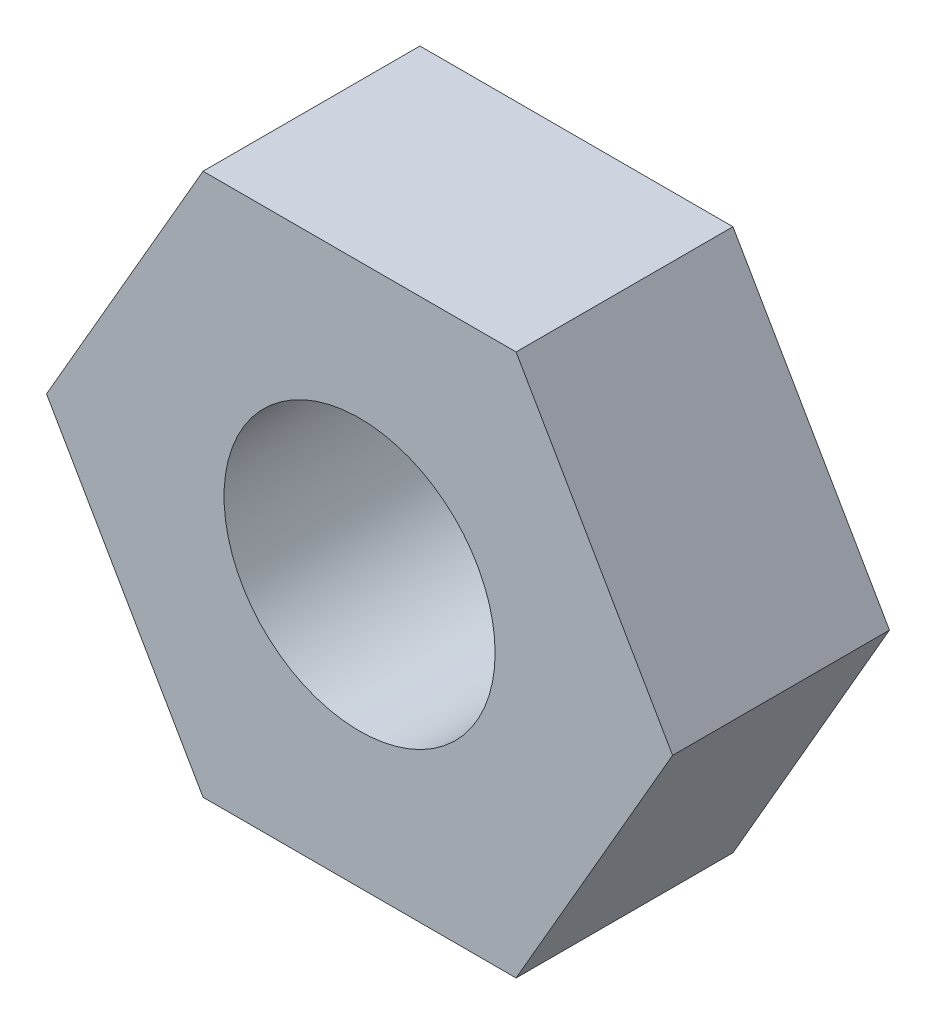
ISO-10303-21;
HEADER;
FILE_DESCRIPTION(('STEP AP214'),'2;1');
FILE_NAME('part.step','',(''),(''),'','','');
FILE_SCHEMA(('AUTOMOTIVE_DESIGN { 1 0 10303 214 1 1 1 1 }'));
ENDSEC;
DATA;
#1=APPLICATION_CONTEXT('core data for automotive mechanical design processes');
#2=APPLICATION_PROTOCOL_DEFINITION('international standard','automotive_design',2000,#1);
#3=PRODUCT_CONTEXT('',#1,'mechanical');
#4=PRODUCT('Part','Part','',(#3));
#5=PRODUCT_RELATED_PRODUCT_CATEGORY('part','',(#4));
#6=PRODUCT_DEFINITION_FORMATION('','',#4);
#7=PRODUCT_DEFINITION_CONTEXT('part definition',#1,'design');
#8=PRODUCT_DEFINITION('design','',#6,#7);
#9=PRODUCT_DEFINITION_SHAPE('','',#8);
#10=(LENGTH_UNIT() NAMED_UNIT(*) SI_UNIT(.MILLI.,.METRE.));
#11=(NAMED_UNIT(*) PLANE_ANGLE_UNIT() SI_UNIT($,.RADIAN.));
#12=(NAMED_UNIT(*) SI_UNIT($,.STERADIAN.) SOLID_ANGLE_UNIT());
#13=UNCERTAINTY_MEASURE_WITH_UNIT(LENGTH_MEASURE(1.E-05),#10,'distance_accuracy_value','');
#14=(GEOMETRIC_REPRESENTATION_CONTEXT(3) GLOBAL_UNCERTAINTY_ASSIGNED_CONTEXT((#13)) GLOBAL_UNIT_ASSIGNED_CONTEXT((#10,
#11,#12)) REPRESENTATION_CONTEXT('',''));
#15=CARTESIAN_POINT('',(0.,0.,0.));
#16=DIRECTION('',(0.,0.,1.));
#17=DIRECTION('',(1.,0.,0.));
#18=AXIS2_PLACEMENT_3D('',#15,#16,#17);
#19=CARTESIAN_POINT('',(0.,0.,1.6));
#20=DIRECTION('',(0.,0.,1.));
#21=DIRECTION('',(1.,0.,0.));
#22=AXIS2_PLACEMENT_3D('',#19,#20,#21);
#23=PLANE('',#22);
#24=DIRECTION('',(0.5,0.866025403784439,0.));
#25=VECTOR('',#24,1.);
#26=CARTESIAN_POINT('',(1.15470053837925,-2.,1.6));
#27=LINE('',#26,#25);
#28=CARTESIAN_POINT('',(1.15470053837925,-2.,1.6));
#29=VERTEX_POINT('',#28);
#30=CARTESIAN_POINT('',(2.3094010767585,0.,1.6));
#31=VERTEX_POINT('',#30);
#32=EDGE_CURVE('E130',#29,#31,#27,.T.);
#33=ORIENTED_EDGE('',*,*,#32,.T.);
#34=DIRECTION('',(-0.5,0.866025403784439,0.));
#35=VECTOR('',#34,1.);
#36=CARTESIAN_POINT('',(2.3094010767585,0.,1.6));
#37=LINE('',#36,#35);
#38=CARTESIAN_POINT('',(1.15470053837925,2.,1.6));
#39=VERTEX_POINT('',#38);
#40=EDGE_CURVE('E88',#31,#39,#37,.T.);
#41=ORIENTED_EDGE('',*,*,#40,.T.);
#42=DIRECTION('',(-1.,0.,0.));
#43=VECTOR('',#42,1.);
#44=CARTESIAN_POINT('',(1.15470053837925,2.,1.6));
#45=LINE('',#44,#43);
#46=CARTESIAN_POINT('',(-1.15470053837925,2.,1.6));
#47=VERTEX_POINT('',#46);
#48=EDGE_CURVE('E101',#39,#47,#45,.T.);
#49=ORIENTED_EDGE('',*,*,#48,.T.);
#50=DIRECTION('',(-0.5,-0.866025403784438,0.));
#51=VECTOR('',#50,1.);
#52=CARTESIAN_POINT('',(-1.15470053837925,2.,1.6));
#53=LINE('',#52,#51);
#54=CARTESIAN_POINT('',(-2.3094010767585,0.,1.6));
#55=VERTEX_POINT('',#54);
#56=EDGE_CURVE('E95',#47,#55,#53,.T.);
#57=ORIENTED_EDGE('',*,*,#56,.T.);
#58=DIRECTION('',(0.5,-0.866025403784439,0.));
#59=VECTOR('',#58,1.);
#60=CARTESIAN_POINT('',(-2.3094010767585,0.,1.6));
#61=LINE('',#60,#59);
#62=CARTESIAN_POINT('',(-1.15470053837925,-2.,1.6));
#63=VERTEX_POINT('',#62);
#64=EDGE_CURVE('E99',#55,#63,#61,.T.);
#65=ORIENTED_EDGE('',*,*,#64,.T.);
#66=DIRECTION('',(1.,0.,0.));
#67=VECTOR('',#66,1.);
#68=CARTESIAN_POINT('',(-1.15470053837925,-2.,1.6));
#69=LINE('',#68,#67);
#70=EDGE_CURVE('E51',#63,#29,#69,.T.);
#71=ORIENTED_EDGE('',*,*,#70,.T.);
#72=EDGE_LOOP('',(#33,#41,#49,#57,#65,#71));
#73=FACE_BOUND('',#72,.T.);
#74=CARTESIAN_POINT('',(0.,0.,1.6));
#75=DIRECTION('',(0.,0.,1.));
#76=DIRECTION('',(1.,0.,0.));
#77=AXIS2_PLACEMENT_3D('',#74,#75,#76);
#78=CIRCLE('',#77,1.);
#79=CARTESIAN_POINT('',(1.,0.,1.6));
#80=VERTEX_POINT('',#79);
#81=EDGE_CURVE('E123',#80,#80,#78,.T.);
#82=ORIENTED_EDGE('',*,*,#81,.F.);
#83=EDGE_LOOP('',(#82));
#84=FACE_BOUND('',#83,.T.);
#85=ADVANCED_FACE('F34',(#73,#84),#23,.T.);
#86=CARTESIAN_POINT('',(0.,0.,0.));
#87=DIRECTION('',(0.,0.,1.));
#88=DIRECTION('',(1.,0.,0.));
#89=AXIS2_PLACEMENT_3D('',#86,#87,#88);
#90=PLANE('',#89);
#91=DIRECTION('',(0.5,0.866025403784439,0.));
#92=VECTOR('',#91,1.);
#93=CARTESIAN_POINT('',(1.15470053837925,-2.,0.));
#94=LINE('',#93,#92);
#95=CARTESIAN_POINT('',(1.15470053837925,-2.,0.));
#96=VERTEX_POINT('',#95);
#97=CARTESIAN_POINT('',(2.3094010767585,0.,0.));
#98=VERTEX_POINT('',#97);
#99=EDGE_CURVE('E119',#96,#98,#94,.T.);
#100=ORIENTED_EDGE('',*,*,#99,.F.);
#101=DIRECTION('',(1.,0.,0.));
#102=VECTOR('',#101,1.);
#103=CARTESIAN_POINT('',(-1.15470053837925,-2.,0.));
#104=LINE('',#103,#102);
#105=CARTESIAN_POINT('',(-1.15470053837925,-2.,0.));
#106=VERTEX_POINT('',#105);
#107=EDGE_CURVE('E80',#106,#96,#104,.T.);
#108=ORIENTED_EDGE('',*,*,#107,.F.);
#109=DIRECTION('',(0.5,-0.866025403784439,0.));
#110=VECTOR('',#109,1.);
#111=CARTESIAN_POINT('',(-2.3094010767585,0.,0.));
#112=LINE('',#111,#110);
#113=CARTESIAN_POINT('',(-2.3094010767585,0.,0.));
#114=VERTEX_POINT('',#113);
#115=EDGE_CURVE('E74',#114,#106,#112,.T.);
#116=ORIENTED_EDGE('',*,*,#115,.F.);
#117=DIRECTION('',(-0.5,-0.866025403784438,0.));
#118=VECTOR('',#117,1.);
#119=CARTESIAN_POINT('',(-1.15470053837925,2.,0.));
#120=LINE('',#119,#118);
#121=CARTESIAN_POINT('',(-1.15470053837925,2.,0.));
#122=VERTEX_POINT('',#121);
#123=EDGE_CURVE('E109',#122,#114,#120,.T.);
#124=ORIENTED_EDGE('',*,*,#123,.F.);
#125=DIRECTION('',(-1.,0.,0.));
#126=VECTOR('',#125,1.);
#127=CARTESIAN_POINT('',(1.15470053837925,2.,0.));
#128=LINE('',#127,#126);
#129=CARTESIAN_POINT('',(1.15470053837925,2.,0.));
#130=VERTEX_POINT('',#129);
#131=EDGE_CURVE('E125',#130,#122,#128,.T.);
#132=ORIENTED_EDGE('',*,*,#131,.F.);
#133=DIRECTION('',(-0.5,0.866025403784439,0.));
#134=VECTOR('',#133,1.);
#135=CARTESIAN_POINT('',(2.3094010767585,0.,0.));
#136=LINE('',#135,#134);
#137=EDGE_CURVE('E122',#98,#130,#136,.T.);
#138=ORIENTED_EDGE('',*,*,#137,.F.);
#139=EDGE_LOOP('',(#100,#108,#116,#124,#132,#138));
#140=FACE_BOUND('',#139,.T.);
#141=CARTESIAN_POINT('',(0.,0.,0.));
#142=DIRECTION('',(0.,0.,1.));
#143=DIRECTION('',(1.,0.,0.));
#144=AXIS2_PLACEMENT_3D('',#141,#142,#143);
#145=CIRCLE('',#144,1.);
#146=CARTESIAN_POINT('',(1.,0.,0.));
#147=VERTEX_POINT('',#146);
#148=EDGE_CURVE('E223',#147,#147,#145,.T.);
#149=ORIENTED_EDGE('',*,*,#148,.T.);
#150=EDGE_LOOP('',(#149));
#151=FACE_BOUND('',#150,.T.);
#152=ADVANCED_FACE('F139',(#140,#151),#90,.F.);
#153=CARTESIAN_POINT('',(1.15470053837925,-2.,1.6));
#154=DIRECTION('',(-0.866025403784439,0.5,0.));
#155=DIRECTION('',(-0.5,-0.866025403784439,0.));
#156=AXIS2_PLACEMENT_3D('',#153,#154,#155);
#157=PLANE('',#156);
#158=ORIENTED_EDGE('',*,*,#99,.T.);
#159=DIRECTION('',(0.,0.,-1.));
#160=VECTOR('',#159,1.);
#161=CARTESIAN_POINT('',(2.3094010767585,0.,1.6));
#162=LINE('',#161,#160);
#163=EDGE_CURVE('E11',#31,#98,#162,.T.);
#164=ORIENTED_EDGE('',*,*,#163,.F.);
#165=ORIENTED_EDGE('',*,*,#32,.F.);
#166=DIRECTION('',(0.,0.,-1.));
#167=VECTOR('',#166,1.);
#168=CARTESIAN_POINT('',(1.15470053837925,-2.,1.6));
#169=LINE('',#168,#167);
#170=EDGE_CURVE('E115',#29,#96,#169,.T.);
#171=ORIENTED_EDGE('',*,*,#170,.T.);
#172=EDGE_LOOP('',(#158,#164,#165,#171));
#173=FACE_BOUND('',#172,.T.);
#174=ADVANCED_FACE('F36',(#173),#157,.F.);
#175=CARTESIAN_POINT('',(2.3094010767585,0.,1.6));
#176=DIRECTION('',(-0.866025403784438,-0.5,0.));
#177=DIRECTION('',(0.5,-0.866025403784439,0.));
#178=AXIS2_PLACEMENT_3D('',#175,#176,#177);
#179=PLANE('',#178);
#180=ORIENTED_EDGE('',*,*,#137,.T.);
#181=DIRECTION('',(0.,0.,-1.));
#182=VECTOR('',#181,1.);
#183=CARTESIAN_POINT('',(1.15470053837925,2.,1.6));
#184=LINE('',#183,#182);
#185=EDGE_CURVE('E43',#39,#130,#184,.T.);
#186=ORIENTED_EDGE('',*,*,#185,.F.);
#187=ORIENTED_EDGE('',*,*,#40,.F.);
#188=ORIENTED_EDGE('',*,*,#163,.T.);
#189=EDGE_LOOP('',(#180,#186,#187,#188));
#190=FACE_BOUND('',#189,.T.);
#191=ADVANCED_FACE('F164',(#190),#179,.F.);
#192=CARTESIAN_POINT('',(1.15470053837925,2.,1.6));
#193=DIRECTION('',(0.,-1.,0.));
#194=DIRECTION('',(0.,0.,-1.));
#195=AXIS2_PLACEMENT_3D('',#192,#193,#194);
#196=PLANE('',#195);
#197=ORIENTED_EDGE('',*,*,#131,.T.);
#198=DIRECTION('',(0.,0.,-1.));
#199=VECTOR('',#198,1.);
#200=CARTESIAN_POINT('',(-1.15470053837925,2.,1.6));
#201=LINE('',#200,#199);
#202=EDGE_CURVE('E110',#47,#122,#201,.T.);
#203=ORIENTED_EDGE('',*,*,#202,.F.);
#204=ORIENTED_EDGE('',*,*,#48,.F.);
#205=ORIENTED_EDGE('',*,*,#185,.T.);
#206=EDGE_LOOP('',(#197,#203,#204,#205));
#207=FACE_BOUND('',#206,.T.);
#208=ADVANCED_FACE('F136',(#207),#196,.F.);
#209=CARTESIAN_POINT('',(-1.15470053837925,2.,1.6));
#210=DIRECTION('',(0.866025403784438,-0.5,0.));
#211=DIRECTION('',(0.5,0.866025403784439,0.));
#212=AXIS2_PLACEMENT_3D('',#209,#210,#211);
#213=PLANE('',#212);
#214=ORIENTED_EDGE('',*,*,#123,.T.);
#215=DIRECTION('',(0.,0.,-1.));
#216=VECTOR('',#215,1.);
#217=CARTESIAN_POINT('',(-2.3094010767585,0.,1.6));
#218=LINE('',#217,#216);
#219=EDGE_CURVE('E106',#55,#114,#218,.T.);
#220=ORIENTED_EDGE('',*,*,#219,.F.);
#221=ORIENTED_EDGE('',*,*,#56,.F.);
#222=ORIENTED_EDGE('',*,*,#202,.T.);
#223=EDGE_LOOP('',(#214,#220,#221,#222));
#224=FACE_BOUND('',#223,.T.);
#225=ADVANCED_FACE('F107',(#224),#213,.F.);
#226=CARTESIAN_POINT('',(-2.3094010767585,0.,1.6));
#227=DIRECTION('',(0.866025403784438,0.5,0.));
#228=DIRECTION('',(-0.5,0.866025403784439,0.));
#229=AXIS2_PLACEMENT_3D('',#226,#227,#228);
#230=PLANE('',#229);
#231=ORIENTED_EDGE('',*,*,#115,.T.);
#232=DIRECTION('',(0.,0.,-1.));
#233=VECTOR('',#232,1.);
#234=CARTESIAN_POINT('',(-1.15470053837925,-2.,1.6));
#235=LINE('',#234,#233);
#236=EDGE_CURVE('E111',#63,#106,#235,.T.);
#237=ORIENTED_EDGE('',*,*,#236,.F.);
#238=ORIENTED_EDGE('',*,*,#64,.F.);
#239=ORIENTED_EDGE('',*,*,#219,.T.);
#240=EDGE_LOOP('',(#231,#237,#238,#239));
#241=FACE_BOUND('',#240,.T.);
#242=ADVANCED_FACE('F113',(#241),#230,.F.);
#243=CARTESIAN_POINT('',(-1.15470053837925,-2.,1.6));
#244=DIRECTION('',(0.,1.,0.));
#245=DIRECTION('',(0.,0.,1.));
#246=AXIS2_PLACEMENT_3D('',#243,#244,#245);
#247=PLANE('',#246);
#248=ORIENTED_EDGE('',*,*,#107,.T.);
#249=ORIENTED_EDGE('',*,*,#170,.F.);
#250=ORIENTED_EDGE('',*,*,#70,.F.);
#251=ORIENTED_EDGE('',*,*,#236,.T.);
#252=EDGE_LOOP('',(#248,#249,#250,#251));
#253=FACE_BOUND('',#252,.T.);
#254=ADVANCED_FACE('F144',(#253),#247,.F.);
#255=CARTESIAN_POINT('',(0.,0.,1.6));
#256=DIRECTION('',(0.,0.,-1.));
#257=DIRECTION('',(-1.,0.,0.));
#258=AXIS2_PLACEMENT_3D('',#255,#256,#257);
#259=CYLINDRICAL_SURFACE('',#258,1.);
#260=ORIENTED_EDGE('',*,*,#81,.T.);
#261=EDGE_LOOP('',(#260));
#262=FACE_BOUND('',#261,.T.);
#263=ORIENTED_EDGE('',*,*,#148,.F.);
#264=EDGE_LOOP('',(#263));
#265=FACE_BOUND('',#264,.T.);
#266=ADVANCED_FACE('F146',(#262,#265),#259,.F.);
#267=CLOSED_SHELL('',(#85,#152,#174,#191,#208,#225,#242,#254,#266));
#268=MANIFOLD_SOLID_BREP('B2',#267);
#269=ADVANCED_BREP_SHAPE_REPRESENTATION('',(#18,#268),#14);
#270=SHAPE_DEFINITION_REPRESENTATION(#9,#269);
ENDSEC;
END-ISO-10303-21;
